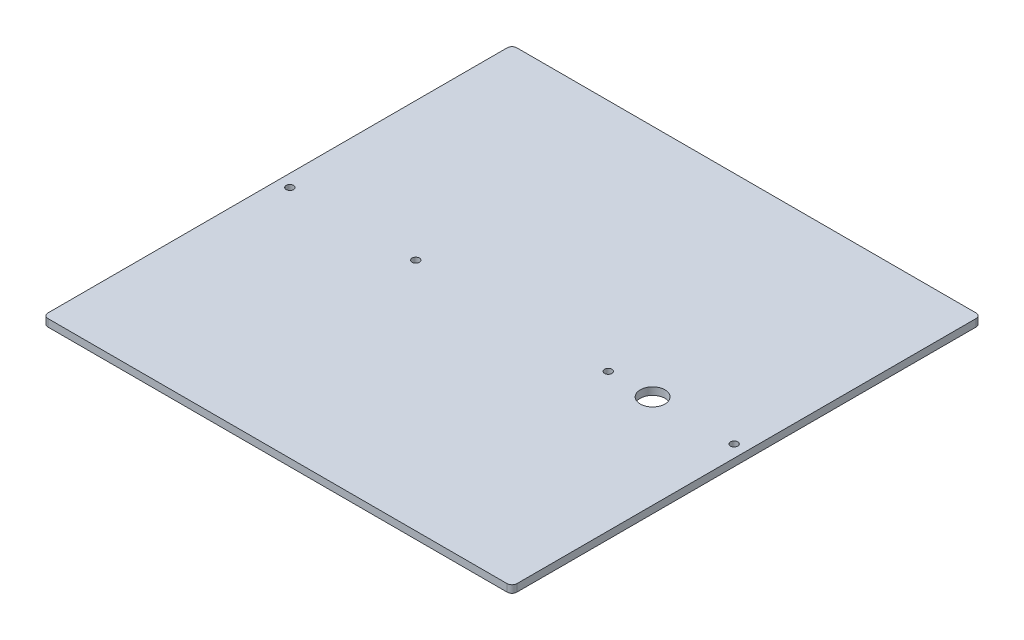
ISO-10303-21;
HEADER;
FILE_DESCRIPTION(('STEP AP214'),'2;1');
FILE_NAME('part.step','',(''),(''),'','','');
FILE_SCHEMA(('AUTOMOTIVE_DESIGN { 1 0 10303 214 1 1 1 1 }'));
ENDSEC;
DATA;
#1=APPLICATION_CONTEXT('core data for automotive mechanical design processes');
#2=APPLICATION_PROTOCOL_DEFINITION('international standard','automotive_design',2000,#1);
#3=PRODUCT_CONTEXT('',#1,'mechanical');
#4=PRODUCT('Part','Part','',(#3));
#5=PRODUCT_RELATED_PRODUCT_CATEGORY('part','',(#4));
#6=PRODUCT_DEFINITION_FORMATION('','',#4);
#7=PRODUCT_DEFINITION_CONTEXT('part definition',#1,'design');
#8=PRODUCT_DEFINITION('design','',#6,#7);
#9=PRODUCT_DEFINITION_SHAPE('','',#8);
#10=(LENGTH_UNIT() NAMED_UNIT(*) SI_UNIT(.MILLI.,.METRE.));
#11=(NAMED_UNIT(*) PLANE_ANGLE_UNIT() SI_UNIT($,.RADIAN.));
#12=(NAMED_UNIT(*) SI_UNIT($,.STERADIAN.) SOLID_ANGLE_UNIT());
#13=UNCERTAINTY_MEASURE_WITH_UNIT(LENGTH_MEASURE(1.E-05),#10,'distance_accuracy_value','');
#14=(GEOMETRIC_REPRESENTATION_CONTEXT(3) GLOBAL_UNCERTAINTY_ASSIGNED_CONTEXT((#13)) GLOBAL_UNIT_ASSIGNED_CONTEXT((#10,
#11,#12)) REPRESENTATION_CONTEXT('',''));
#15=CARTESIAN_POINT('',(0.,0.,0.));
#16=DIRECTION('',(0.,0.,1.));
#17=DIRECTION('',(1.,0.,0.));
#18=AXIS2_PLACEMENT_3D('',#15,#16,#17);
#19=CARTESIAN_POINT('',(0.,3.,-190.));
#20=DIRECTION('',(0.,0.,1.));
#21=DIRECTION('',(1.,0.,0.));
#22=AXIS2_PLACEMENT_3D('',#19,#20,#21);
#23=PLANE('',#22);
#24=DIRECTION('',(-1.,0.,0.));
#25=VECTOR('',#24,1.);
#26=CARTESIAN_POINT('',(0.,0.,-190.));
#27=LINE('',#26,#25);
#28=CARTESIAN_POINT('',(188.,0.,-190.));
#29=VERTEX_POINT('',#28);
#30=CARTESIAN_POINT('',(2.,0.,-190.));
#31=VERTEX_POINT('',#30);
#32=EDGE_CURVE('E128',#29,#31,#27,.T.);
#33=ORIENTED_EDGE('',*,*,#32,.T.);
#34=DIRECTION('',(0.,-1.,0.));
#35=VECTOR('',#34,1.);
#36=CARTESIAN_POINT('',(2.,3.,-190.));
#37=LINE('',#36,#35);
#38=CARTESIAN_POINT('',(2.,3.,-190.));
#39=VERTEX_POINT('',#38);
#40=EDGE_CURVE('E105',#31,#39,#37,.F.);
#41=ORIENTED_EDGE('',*,*,#40,.T.);
#42=DIRECTION('',(-1.,0.,0.));
#43=VECTOR('',#42,1.);
#44=CARTESIAN_POINT('',(0.,3.,-190.));
#45=LINE('',#44,#43);
#46=CARTESIAN_POINT('',(188.,3.,-190.));
#47=VERTEX_POINT('',#46);
#48=EDGE_CURVE('E250',#47,#39,#45,.T.);
#49=ORIENTED_EDGE('',*,*,#48,.F.);
#50=DIRECTION('',(0.,-1.,0.));
#51=VECTOR('',#50,1.);
#52=CARTESIAN_POINT('',(188.,3.,-190.));
#53=LINE('',#52,#51);
#54=EDGE_CURVE('E110',#47,#29,#53,.T.);
#55=ORIENTED_EDGE('',*,*,#54,.T.);
#56=EDGE_LOOP('',(#33,#41,#49,#55));
#57=FACE_BOUND('',#56,.T.);
#58=ADVANCED_FACE('F34',(#57),#23,.F.);
#59=CARTESIAN_POINT('',(0.,3.,0.));
#60=DIRECTION('',(1.,0.,0.));
#61=DIRECTION('',(0.,0.,-1.));
#62=AXIS2_PLACEMENT_3D('',#59,#60,#61);
#63=PLANE('',#62);
#64=DIRECTION('',(0.,0.,1.));
#65=VECTOR('',#64,1.);
#66=CARTESIAN_POINT('',(0.,3.,0.));
#67=LINE('',#66,#65);
#68=CARTESIAN_POINT('',(0.,3.,-188.));
#69=VERTEX_POINT('',#68);
#70=CARTESIAN_POINT('',(0.,3.,-2.));
#71=VERTEX_POINT('',#70);
#72=EDGE_CURVE('E120',#69,#71,#67,.T.);
#73=ORIENTED_EDGE('',*,*,#72,.F.);
#74=DIRECTION('',(0.,-1.,0.));
#75=VECTOR('',#74,1.);
#76=CARTESIAN_POINT('',(0.,3.,-188.));
#77=LINE('',#76,#75);
#78=CARTESIAN_POINT('',(0.,0.,-188.));
#79=VERTEX_POINT('',#78);
#80=EDGE_CURVE('E104',#69,#79,#77,.T.);
#81=ORIENTED_EDGE('',*,*,#80,.T.);
#82=DIRECTION('',(0.,0.,1.));
#83=VECTOR('',#82,1.);
#84=CARTESIAN_POINT('',(0.,0.,0.));
#85=LINE('',#84,#83);
#86=CARTESIAN_POINT('',(0.,0.,-2.));
#87=VERTEX_POINT('',#86);
#88=EDGE_CURVE('E117',#79,#87,#85,.T.);
#89=ORIENTED_EDGE('',*,*,#88,.T.);
#90=DIRECTION('',(0.,-1.,0.));
#91=VECTOR('',#90,1.);
#92=CARTESIAN_POINT('',(0.,3.,-2.));
#93=LINE('',#92,#91);
#94=EDGE_CURVE('E122',#87,#71,#93,.F.);
#95=ORIENTED_EDGE('',*,*,#94,.T.);
#96=EDGE_LOOP('',(#73,#81,#89,#95));
#97=FACE_BOUND('',#96,.T.);
#98=ADVANCED_FACE('F116',(#97),#63,.F.);
#99=CARTESIAN_POINT('',(0.,3.,0.));
#100=DIRECTION('',(0.,0.,-1.));
#101=DIRECTION('',(-1.,0.,0.));
#102=AXIS2_PLACEMENT_3D('',#99,#100,#101);
#103=PLANE('',#102);
#104=DIRECTION('',(1.,0.,0.));
#105=VECTOR('',#104,1.);
#106=CARTESIAN_POINT('',(0.,0.,0.));
#107=LINE('',#106,#105);
#108=CARTESIAN_POINT('',(2.,0.,0.));
#109=VERTEX_POINT('',#108);
#110=CARTESIAN_POINT('',(188.,0.,0.));
#111=VERTEX_POINT('',#110);
#112=EDGE_CURVE('E127',#109,#111,#107,.T.);
#113=ORIENTED_EDGE('',*,*,#112,.T.);
#114=DIRECTION('',(0.,-1.,0.));
#115=VECTOR('',#114,1.);
#116=CARTESIAN_POINT('',(188.,3.,0.));
#117=LINE('',#116,#115);
#118=CARTESIAN_POINT('',(188.,3.,0.));
#119=VERTEX_POINT('',#118);
#120=EDGE_CURVE('E11',#111,#119,#117,.F.);
#121=ORIENTED_EDGE('',*,*,#120,.T.);
#122=DIRECTION('',(1.,0.,0.));
#123=VECTOR('',#122,1.);
#124=CARTESIAN_POINT('',(0.,3.,0.));
#125=LINE('',#124,#123);
#126=CARTESIAN_POINT('',(2.,3.,0.));
#127=VERTEX_POINT('',#126);
#128=EDGE_CURVE('E167',#127,#119,#125,.T.);
#129=ORIENTED_EDGE('',*,*,#128,.F.);
#130=DIRECTION('',(0.,-1.,0.));
#131=VECTOR('',#130,1.);
#132=CARTESIAN_POINT('',(2.,3.,0.));
#133=LINE('',#132,#131);
#134=EDGE_CURVE('E42',#127,#109,#133,.T.);
#135=ORIENTED_EDGE('',*,*,#134,.T.);
#136=EDGE_LOOP('',(#113,#121,#129,#135));
#137=FACE_BOUND('',#136,.T.);
#138=ADVANCED_FACE('F165',(#137),#103,.F.);
#139=CARTESIAN_POINT('',(190.,3.,0.));
#140=DIRECTION('',(-1.,0.,0.));
#141=DIRECTION('',(0.,0.,1.));
#142=AXIS2_PLACEMENT_3D('',#139,#140,#141);
#143=PLANE('',#142);
#144=DIRECTION('',(0.,0.,-1.));
#145=VECTOR('',#144,1.);
#146=CARTESIAN_POINT('',(190.,0.,0.));
#147=LINE('',#146,#145);
#148=CARTESIAN_POINT('',(190.,0.,-2.));
#149=VERTEX_POINT('',#148);
#150=CARTESIAN_POINT('',(190.,0.,-188.));
#151=VERTEX_POINT('',#150);
#152=EDGE_CURVE('E131',#149,#151,#147,.T.);
#153=ORIENTED_EDGE('',*,*,#152,.T.);
#154=DIRECTION('',(0.,-1.,0.));
#155=VECTOR('',#154,1.);
#156=CARTESIAN_POINT('',(190.,3.,-188.));
#157=LINE('',#156,#155);
#158=CARTESIAN_POINT('',(190.,3.,-188.));
#159=VERTEX_POINT('',#158);
#160=EDGE_CURVE('E49',#151,#159,#157,.F.);
#161=ORIENTED_EDGE('',*,*,#160,.T.);
#162=DIRECTION('',(0.,0.,-1.));
#163=VECTOR('',#162,1.);
#164=CARTESIAN_POINT('',(190.,3.,0.));
#165=LINE('',#164,#163);
#166=CARTESIAN_POINT('',(190.,3.,-2.));
#167=VERTEX_POINT('',#166);
#168=EDGE_CURVE('E175',#167,#159,#165,.T.);
#169=ORIENTED_EDGE('',*,*,#168,.F.);
#170=DIRECTION('',(0.,-1.,0.));
#171=VECTOR('',#170,1.);
#172=CARTESIAN_POINT('',(190.,3.,-2.));
#173=LINE('',#172,#171);
#174=EDGE_CURVE('E158',#167,#149,#173,.T.);
#175=ORIENTED_EDGE('',*,*,#174,.T.);
#176=EDGE_LOOP('',(#153,#161,#169,#175));
#177=FACE_BOUND('',#176,.T.);
#178=ADVANCED_FACE('F174',(#177),#143,.F.);
#179=CARTESIAN_POINT('',(134.,3.,-95.));
#180=DIRECTION('',(0.,-1.,0.));
#181=DIRECTION('',(0.,0.,-1.));
#182=AXIS2_PLACEMENT_3D('',#179,#180,#181);
#183=CYLINDRICAL_SURFACE('',#182,1.5);
#184=CARTESIAN_POINT('',(134.,3.,-95.));
#185=DIRECTION('',(0.,1.,0.));
#186=DIRECTION('',(0.,0.,1.));
#187=AXIS2_PLACEMENT_3D('',#184,#185,#186);
#188=CIRCLE('',#187,1.5);
#189=CARTESIAN_POINT('',(134.,3.,-93.5));
#190=VERTEX_POINT('',#189);
#191=EDGE_CURVE('E246',#190,#190,#188,.T.);
#192=ORIENTED_EDGE('',*,*,#191,.T.);
#193=EDGE_LOOP('',(#192));
#194=FACE_BOUND('',#193,.T.);
#195=CARTESIAN_POINT('',(134.,0.,-95.));
#196=DIRECTION('',(0.,1.,0.));
#197=DIRECTION('',(0.,0.,1.));
#198=AXIS2_PLACEMENT_3D('',#195,#196,#197);
#199=CIRCLE('',#198,1.5);
#200=CARTESIAN_POINT('',(134.,0.,-93.5));
#201=VERTEX_POINT('',#200);
#202=EDGE_CURVE('E133',#201,#201,#199,.T.);
#203=ORIENTED_EDGE('',*,*,#202,.F.);
#204=EDGE_LOOP('',(#203));
#205=FACE_BOUND('',#204,.T.);
#206=ADVANCED_FACE('F195',(#194,#205),#183,.F.);
#207=CARTESIAN_POINT('',(56.,3.,-95.));
#208=DIRECTION('',(0.,-1.,0.));
#209=DIRECTION('',(0.,0.,-1.));
#210=AXIS2_PLACEMENT_3D('',#207,#208,#209);
#211=CYLINDRICAL_SURFACE('',#210,1.5);
#212=CARTESIAN_POINT('',(56.,3.,-95.));
#213=DIRECTION('',(0.,1.,0.));
#214=DIRECTION('',(0.,0.,1.));
#215=AXIS2_PLACEMENT_3D('',#212,#213,#214);
#216=CIRCLE('',#215,1.5);
#217=CARTESIAN_POINT('',(56.,3.,-93.5));
#218=VERTEX_POINT('',#217);
#219=EDGE_CURVE('E244',#218,#218,#216,.F.);
#220=ORIENTED_EDGE('',*,*,#219,.F.);
#221=EDGE_LOOP('',(#220));
#222=FACE_BOUND('',#221,.T.);
#223=CARTESIAN_POINT('',(56.,0.,-95.));
#224=DIRECTION('',(0.,1.,0.));
#225=DIRECTION('',(0.,0.,1.));
#226=AXIS2_PLACEMENT_3D('',#223,#224,#225);
#227=CIRCLE('',#226,1.5);
#228=CARTESIAN_POINT('',(56.,0.,-93.5));
#229=VERTEX_POINT('',#228);
#230=EDGE_CURVE('E189',#229,#229,#227,.F.);
#231=ORIENTED_EDGE('',*,*,#230,.T.);
#232=EDGE_LOOP('',(#231));
#233=FACE_BOUND('',#232,.T.);
#234=ADVANCED_FACE('F197',(#222,#233),#211,.F.);
#235=CARTESIAN_POINT('',(185.,3.,-95.));
#236=DIRECTION('',(0.,-1.,0.));
#237=DIRECTION('',(0.,0.,-1.));
#238=AXIS2_PLACEMENT_3D('',#235,#236,#237);
#239=CYLINDRICAL_SURFACE('',#238,1.5);
#240=CARTESIAN_POINT('',(185.,3.,-95.));
#241=DIRECTION('',(0.,1.,0.));
#242=DIRECTION('',(0.,0.,1.));
#243=AXIS2_PLACEMENT_3D('',#240,#241,#242);
#244=CIRCLE('',#243,1.5);
#245=CARTESIAN_POINT('',(185.,3.,-93.5));
#246=VERTEX_POINT('',#245);
#247=EDGE_CURVE('E240',#246,#246,#244,.T.);
#248=ORIENTED_EDGE('',*,*,#247,.T.);
#249=EDGE_LOOP('',(#248));
#250=FACE_BOUND('',#249,.T.);
#251=CARTESIAN_POINT('',(185.,0.,-95.));
#252=DIRECTION('',(0.,1.,0.));
#253=DIRECTION('',(0.,0.,1.));
#254=AXIS2_PLACEMENT_3D('',#251,#252,#253);
#255=CIRCLE('',#254,1.5);
#256=CARTESIAN_POINT('',(185.,0.,-93.5));
#257=VERTEX_POINT('',#256);
#258=EDGE_CURVE('E186',#257,#257,#255,.T.);
#259=ORIENTED_EDGE('',*,*,#258,.F.);
#260=EDGE_LOOP('',(#259));
#261=FACE_BOUND('',#260,.T.);
#262=ADVANCED_FACE('F204',(#250,#261),#239,.F.);
#263=CARTESIAN_POINT('',(5.00000000000001,3.,-95.));
#264=DIRECTION('',(0.,-1.,0.));
#265=DIRECTION('',(0.,0.,-1.));
#266=AXIS2_PLACEMENT_3D('',#263,#264,#265);
#267=CYLINDRICAL_SURFACE('',#266,1.5);
#268=CARTESIAN_POINT('',(5.00000000000001,3.,-95.));
#269=DIRECTION('',(0.,1.,0.));
#270=DIRECTION('',(0.,0.,1.));
#271=AXIS2_PLACEMENT_3D('',#268,#269,#270);
#272=CIRCLE('',#271,1.5);
#273=CARTESIAN_POINT('',(5.00000000000001,3.,-93.5));
#274=VERTEX_POINT('',#273);
#275=EDGE_CURVE('E141',#274,#274,#272,.T.);
#276=ORIENTED_EDGE('',*,*,#275,.T.);
#277=EDGE_LOOP('',(#276));
#278=FACE_BOUND('',#277,.T.);
#279=CARTESIAN_POINT('',(5.00000000000001,0.,-95.));
#280=DIRECTION('',(0.,1.,0.));
#281=DIRECTION('',(0.,0.,1.));
#282=AXIS2_PLACEMENT_3D('',#279,#280,#281);
#283=CIRCLE('',#282,1.5);
#284=CARTESIAN_POINT('',(5.00000000000001,0.,-93.5));
#285=VERTEX_POINT('',#284);
#286=EDGE_CURVE('E183',#285,#285,#283,.T.);
#287=ORIENTED_EDGE('',*,*,#286,.F.);
#288=EDGE_LOOP('',(#287));
#289=FACE_BOUND('',#288,.T.);
#290=ADVANCED_FACE('F225',(#278,#289),#267,.F.);
#291=CARTESIAN_POINT('',(151.970083663484,3.,-95.));
#292=DIRECTION('',(0.,-1.,0.));
#293=DIRECTION('',(0.,0.,-1.));
#294=AXIS2_PLACEMENT_3D('',#291,#292,#293);
#295=CYLINDRICAL_SURFACE('',#294,4.99999999999999);
#296=CARTESIAN_POINT('',(151.970083663484,3.,-95.));
#297=DIRECTION('',(0.,1.,0.));
#298=DIRECTION('',(0.,0.,1.));
#299=AXIS2_PLACEMENT_3D('',#296,#297,#298);
#300=CIRCLE('',#299,4.99999999999999);
#301=CARTESIAN_POINT('',(151.970083663484,3.,-90.));
#302=VERTEX_POINT('',#301);
#303=EDGE_CURVE('E142',#302,#302,#300,.F.);
#304=ORIENTED_EDGE('',*,*,#303,.F.);
#305=EDGE_LOOP('',(#304));
#306=FACE_BOUND('',#305,.T.);
#307=CARTESIAN_POINT('',(151.970083663484,0.,-95.));
#308=DIRECTION('',(0.,1.,0.));
#309=DIRECTION('',(0.,0.,1.));
#310=AXIS2_PLACEMENT_3D('',#307,#308,#309);
#311=CIRCLE('',#310,4.99999999999999);
#312=CARTESIAN_POINT('',(151.970083663484,0.,-90.));
#313=VERTEX_POINT('',#312);
#314=EDGE_CURVE('E138',#313,#313,#311,.F.);
#315=ORIENTED_EDGE('',*,*,#314,.T.);
#316=EDGE_LOOP('',(#315));
#317=FACE_BOUND('',#316,.T.);
#318=ADVANCED_FACE('F221',(#306,#317),#295,.F.);
#319=CARTESIAN_POINT('',(0.,3.,0.));
#320=DIRECTION('',(0.,1.,0.));
#321=DIRECTION('',(0.,0.,1.));
#322=AXIS2_PLACEMENT_3D('',#319,#320,#321);
#323=PLANE('',#322);
#324=ORIENTED_EDGE('',*,*,#275,.F.);
#325=EDGE_LOOP('',(#324));
#326=FACE_BOUND('',#325,.T.);
#327=ORIENTED_EDGE('',*,*,#247,.F.);
#328=EDGE_LOOP('',(#327));
#329=FACE_BOUND('',#328,.T.);
#330=ORIENTED_EDGE('',*,*,#219,.T.);
#331=EDGE_LOOP('',(#330));
#332=FACE_BOUND('',#331,.T.);
#333=ORIENTED_EDGE('',*,*,#191,.F.);
#334=EDGE_LOOP('',(#333));
#335=FACE_BOUND('',#334,.T.);
#336=ORIENTED_EDGE('',*,*,#48,.T.);
#337=CARTESIAN_POINT('',(2.,3.,-188.));
#338=DIRECTION('',(0.,1.,0.));
#339=DIRECTION('',(0.,0.,1.));
#340=AXIS2_PLACEMENT_3D('',#337,#338,#339);
#341=CIRCLE('',#340,2.);
#342=EDGE_CURVE('E156',#39,#69,#341,.T.);
#343=ORIENTED_EDGE('',*,*,#342,.T.);
#344=ORIENTED_EDGE('',*,*,#72,.T.);
#345=CARTESIAN_POINT('',(2.,3.,-2.));
#346=DIRECTION('',(0.,1.,0.));
#347=DIRECTION('',(0.,0.,1.));
#348=AXIS2_PLACEMENT_3D('',#345,#346,#347);
#349=CIRCLE('',#348,2.);
#350=EDGE_CURVE('E151',#71,#127,#349,.T.);
#351=ORIENTED_EDGE('',*,*,#350,.T.);
#352=ORIENTED_EDGE('',*,*,#128,.T.);
#353=CARTESIAN_POINT('',(188.,3.,-2.));
#354=DIRECTION('',(0.,1.,0.));
#355=DIRECTION('',(0.,0.,1.));
#356=AXIS2_PLACEMENT_3D('',#353,#354,#355);
#357=CIRCLE('',#356,2.);
#358=EDGE_CURVE('E56',#119,#167,#357,.T.);
#359=ORIENTED_EDGE('',*,*,#358,.T.);
#360=ORIENTED_EDGE('',*,*,#168,.T.);
#361=CARTESIAN_POINT('',(188.,3.,-188.));
#362=DIRECTION('',(0.,1.,0.));
#363=DIRECTION('',(0.,0.,1.));
#364=AXIS2_PLACEMENT_3D('',#361,#362,#363);
#365=CIRCLE('',#364,2.);
#366=EDGE_CURVE('E154',#159,#47,#365,.T.);
#367=ORIENTED_EDGE('',*,*,#366,.T.);
#368=EDGE_LOOP('',(#336,#343,#344,#351,#352,#359,#360,#367));
#369=FACE_BOUND('',#368,.T.);
#370=ORIENTED_EDGE('',*,*,#303,.T.);
#371=EDGE_LOOP('',(#370));
#372=FACE_BOUND('',#371,.T.);
#373=ADVANCED_FACE('F224',(#326,#329,#332,#335,#369,#372),#323,.T.);
#374=CARTESIAN_POINT('',(0.,0.,0.));
#375=DIRECTION('',(0.,1.,0.));
#376=DIRECTION('',(0.,0.,1.));
#377=AXIS2_PLACEMENT_3D('',#374,#375,#376);
#378=PLANE('',#377);
#379=ORIENTED_EDGE('',*,*,#286,.T.);
#380=EDGE_LOOP('',(#379));
#381=FACE_BOUND('',#380,.T.);
#382=ORIENTED_EDGE('',*,*,#258,.T.);
#383=EDGE_LOOP('',(#382));
#384=FACE_BOUND('',#383,.T.);
#385=ORIENTED_EDGE('',*,*,#230,.F.);
#386=EDGE_LOOP('',(#385));
#387=FACE_BOUND('',#386,.T.);
#388=ORIENTED_EDGE('',*,*,#202,.T.);
#389=EDGE_LOOP('',(#388));
#390=FACE_BOUND('',#389,.T.);
#391=ORIENTED_EDGE('',*,*,#88,.F.);
#392=CARTESIAN_POINT('',(2.,0.,-188.));
#393=DIRECTION('',(0.,1.,0.));
#394=DIRECTION('',(0.,0.,1.));
#395=AXIS2_PLACEMENT_3D('',#392,#393,#394);
#396=CIRCLE('',#395,2.);
#397=EDGE_CURVE('E100',#79,#31,#396,.F.);
#398=ORIENTED_EDGE('',*,*,#397,.T.);
#399=ORIENTED_EDGE('',*,*,#32,.F.);
#400=CARTESIAN_POINT('',(188.,0.,-188.));
#401=DIRECTION('',(0.,1.,0.));
#402=DIRECTION('',(0.,0.,1.));
#403=AXIS2_PLACEMENT_3D('',#400,#401,#402);
#404=CIRCLE('',#403,2.);
#405=EDGE_CURVE('E111',#29,#151,#404,.F.);
#406=ORIENTED_EDGE('',*,*,#405,.T.);
#407=ORIENTED_EDGE('',*,*,#152,.F.);
#408=CARTESIAN_POINT('',(188.,0.,-2.));
#409=DIRECTION('',(0.,1.,0.));
#410=DIRECTION('',(0.,0.,1.));
#411=AXIS2_PLACEMENT_3D('',#408,#409,#410);
#412=CIRCLE('',#411,2.);
#413=EDGE_CURVE('E145',#149,#111,#412,.F.);
#414=ORIENTED_EDGE('',*,*,#413,.T.);
#415=ORIENTED_EDGE('',*,*,#112,.F.);
#416=CARTESIAN_POINT('',(2.,0.,-2.));
#417=DIRECTION('',(0.,1.,0.));
#418=DIRECTION('',(0.,0.,1.));
#419=AXIS2_PLACEMENT_3D('',#416,#417,#418);
#420=CIRCLE('',#419,2.);
#421=EDGE_CURVE('E121',#109,#87,#420,.F.);
#422=ORIENTED_EDGE('',*,*,#421,.T.);
#423=EDGE_LOOP('',(#391,#398,#399,#406,#407,#414,#415,#422));
#424=FACE_BOUND('',#423,.T.);
#425=ORIENTED_EDGE('',*,*,#314,.F.);
#426=EDGE_LOOP('',(#425));
#427=FACE_BOUND('',#426,.T.);
#428=ADVANCED_FACE('F124',(#381,#384,#387,#390,#424,#427),#378,.F.);
#429=CARTESIAN_POINT('',(2.,3.,-188.));
#430=DIRECTION('',(0.,-1.,0.));
#431=DIRECTION('',(0.,0.,-1.));
#432=AXIS2_PLACEMENT_3D('',#429,#430,#431);
#433=CYLINDRICAL_SURFACE('',#432,2.);
#434=ORIENTED_EDGE('',*,*,#342,.F.);
#435=ORIENTED_EDGE('',*,*,#40,.F.);
#436=ORIENTED_EDGE('',*,*,#397,.F.);
#437=ORIENTED_EDGE('',*,*,#80,.F.);
#438=EDGE_LOOP('',(#434,#435,#436,#437));
#439=FACE_BOUND('',#438,.T.);
#440=ADVANCED_FACE('F103',(#439),#433,.T.);
#441=CARTESIAN_POINT('',(188.,3.,-188.));
#442=DIRECTION('',(0.,-1.,0.));
#443=DIRECTION('',(0.,0.,-1.));
#444=AXIS2_PLACEMENT_3D('',#441,#442,#443);
#445=CYLINDRICAL_SURFACE('',#444,2.);
#446=ORIENTED_EDGE('',*,*,#366,.F.);
#447=ORIENTED_EDGE('',*,*,#160,.F.);
#448=ORIENTED_EDGE('',*,*,#405,.F.);
#449=ORIENTED_EDGE('',*,*,#54,.F.);
#450=EDGE_LOOP('',(#446,#447,#448,#449));
#451=FACE_BOUND('',#450,.T.);
#452=ADVANCED_FACE('F279',(#451),#445,.T.);
#453=CARTESIAN_POINT('',(188.,3.,-2.));
#454=DIRECTION('',(0.,-1.,0.));
#455=DIRECTION('',(0.,0.,-1.));
#456=AXIS2_PLACEMENT_3D('',#453,#454,#455);
#457=CYLINDRICAL_SURFACE('',#456,2.);
#458=ORIENTED_EDGE('',*,*,#358,.F.);
#459=ORIENTED_EDGE('',*,*,#120,.F.);
#460=ORIENTED_EDGE('',*,*,#413,.F.);
#461=ORIENTED_EDGE('',*,*,#174,.F.);
#462=EDGE_LOOP('',(#458,#459,#460,#461));
#463=FACE_BOUND('',#462,.T.);
#464=ADVANCED_FACE('F173',(#463),#457,.T.);
#465=CARTESIAN_POINT('',(2.,3.,-2.));
#466=DIRECTION('',(0.,-1.,0.));
#467=DIRECTION('',(0.,0.,-1.));
#468=AXIS2_PLACEMENT_3D('',#465,#466,#467);
#469=CYLINDRICAL_SURFACE('',#468,2.);
#470=ORIENTED_EDGE('',*,*,#350,.F.);
#471=ORIENTED_EDGE('',*,*,#94,.F.);
#472=ORIENTED_EDGE('',*,*,#421,.F.);
#473=ORIENTED_EDGE('',*,*,#134,.F.);
#474=EDGE_LOOP('',(#470,#471,#472,#473));
#475=FACE_BOUND('',#474,.T.);
#476=ADVANCED_FACE('F36',(#475),#469,.T.);
#477=CLOSED_SHELL('',(#58,#98,#138,#178,#206,#234,#262,#290,#318,#373,#428,#440,#452,#464,#476));
#478=MANIFOLD_SOLID_BREP('B2',#477);
#479=ADVANCED_BREP_SHAPE_REPRESENTATION('',(#18,#478),#14);
#480=SHAPE_DEFINITION_REPRESENTATION(#9,#479);
ENDSEC;
END-ISO-10303-21;
